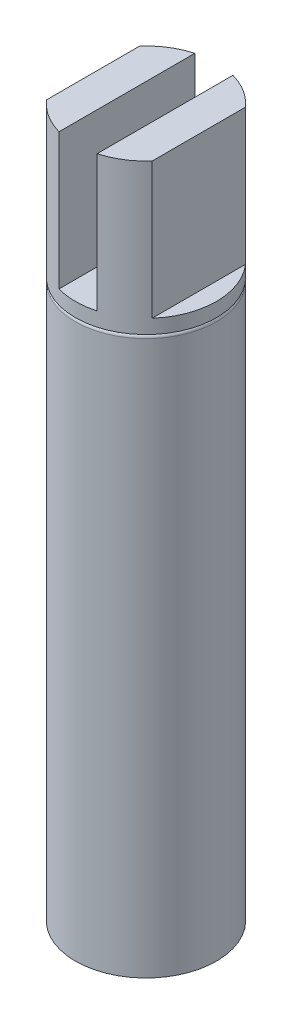
ISO-10303-21;
HEADER;
FILE_DESCRIPTION(('STEP AP214'),'2;1');
FILE_NAME('part.step','',(''),(''),'','','');
FILE_SCHEMA(('AUTOMOTIVE_DESIGN { 1 0 10303 214 1 1 1 1 }'));
ENDSEC;
DATA;
#1=APPLICATION_CONTEXT('core data for automotive mechanical design processes');
#2=APPLICATION_PROTOCOL_DEFINITION('international standard','automotive_design',2000,#1);
#3=PRODUCT_CONTEXT('',#1,'mechanical');
#4=PRODUCT('Part','Part','',(#3));
#5=PRODUCT_RELATED_PRODUCT_CATEGORY('part','',(#4));
#6=PRODUCT_DEFINITION_FORMATION('','',#4);
#7=PRODUCT_DEFINITION_CONTEXT('part definition',#1,'design');
#8=PRODUCT_DEFINITION('design','',#6,#7);
#9=PRODUCT_DEFINITION_SHAPE('','',#8);
#10=(LENGTH_UNIT() NAMED_UNIT(*) SI_UNIT(.MILLI.,.METRE.));
#11=(NAMED_UNIT(*) PLANE_ANGLE_UNIT() SI_UNIT($,.RADIAN.));
#12=(NAMED_UNIT(*) SI_UNIT($,.STERADIAN.) SOLID_ANGLE_UNIT());
#13=UNCERTAINTY_MEASURE_WITH_UNIT(LENGTH_MEASURE(1.E-05),#10,'distance_accuracy_value','');
#14=(GEOMETRIC_REPRESENTATION_CONTEXT(3) GLOBAL_UNCERTAINTY_ASSIGNED_CONTEXT((#13)) GLOBAL_UNIT_ASSIGNED_CONTEXT((#10,
#11,#12)) REPRESENTATION_CONTEXT('',''));
#15=CARTESIAN_POINT('',(0.,0.,0.));
#16=DIRECTION('',(0.,0.,1.));
#17=DIRECTION('',(1.,0.,0.));
#18=AXIS2_PLACEMENT_3D('',#15,#16,#17);
#19=CARTESIAN_POINT('',(0.,81.,0.));
#20=DIRECTION('',(0.,1.,0.));
#21=DIRECTION('',(0.,0.,1.));
#22=AXIS2_PLACEMENT_3D('',#19,#20,#21);
#23=PLANE('',#22);
#24=CARTESIAN_POINT('',(0.,81.,0.));
#25=DIRECTION('',(0.,1.,0.));
#26=DIRECTION('',(0.,0.,1.));
#27=AXIS2_PLACEMENT_3D('',#24,#25,#26);
#28=CIRCLE('',#27,10.);
#29=CARTESIAN_POINT('',(-2.7,81.,9.62860322165162));
#30=VERTEX_POINT('',#29);
#31=CARTESIAN_POINT('',(2.7,81.,9.62860322165162));
#32=VERTEX_POINT('',#31);
#33=EDGE_CURVE('E158',#30,#32,#28,.T.);
#34=ORIENTED_EDGE('',*,*,#33,.T.);
#35=DIRECTION('',(0.,0.,1.));
#36=VECTOR('',#35,1.);
#37=CARTESIAN_POINT('',(2.7,81.,0.));
#38=LINE('',#37,#36);
#39=CARTESIAN_POINT('',(2.69999999999999,81.,-9.62860322165162));
#40=VERTEX_POINT('',#39);
#41=EDGE_CURVE('E120',#40,#32,#38,.T.);
#42=ORIENTED_EDGE('',*,*,#41,.F.);
#43=CARTESIAN_POINT('',(-2.7,81.,-9.62860322165162));
#44=VERTEX_POINT('',#43);
#45=EDGE_CURVE('E161',#40,#44,#28,.T.);
#46=ORIENTED_EDGE('',*,*,#45,.T.);
#47=DIRECTION('',(0.,0.,1.));
#48=VECTOR('',#47,1.);
#49=CARTESIAN_POINT('',(-2.7,81.,0.));
#50=LINE('',#49,#48);
#51=EDGE_CURVE('E103',#44,#30,#50,.T.);
#52=ORIENTED_EDGE('',*,*,#51,.T.);
#53=EDGE_LOOP('',(#34,#42,#46,#52));
#54=FACE_BOUND('',#53,.T.);
#55=ADVANCED_FACE('F34',(#54),#23,.T.);
#56=DIRECTION('',(0.,0.,1.));
#57=VECTOR('',#56,1.);
#58=CARTESIAN_POINT('',(7.5,81.,0.));
#59=LINE('',#58,#57);
#60=CARTESIAN_POINT('',(7.5,81.,-6.61437827766147));
#61=VERTEX_POINT('',#60);
#62=CARTESIAN_POINT('',(7.5,81.,6.61437827766147));
#63=VERTEX_POINT('',#62);
#64=EDGE_CURVE('E52',#61,#63,#59,.T.);
#65=ORIENTED_EDGE('',*,*,#64,.T.);
#66=EDGE_CURVE('E48',#63,#61,#28,.T.);
#67=ORIENTED_EDGE('',*,*,#66,.T.);
#68=EDGE_LOOP('',(#65,#67));
#69=FACE_BOUND('',#68,.T.);
#70=ADVANCED_FACE('F186',(#69),#23,.T.);
#71=CARTESIAN_POINT('',(0.,79.,0.));
#72=DIRECTION('',(0.,-1.,0.));
#73=DIRECTION('',(0.,0.,-1.));
#74=AXIS2_PLACEMENT_3D('',#71,#72,#73);
#75=CYLINDRICAL_SURFACE('',#74,10.);
#76=CARTESIAN_POINT('',(0.,78.5,0.));
#77=DIRECTION('',(0.,1.,0.));
#78=DIRECTION('',(0.,0.,1.));
#79=AXIS2_PLACEMENT_3D('',#76,#77,#78);
#80=CIRCLE('',#79,10.);
#81=CARTESIAN_POINT('',(0.,78.5,10.));
#82=VERTEX_POINT('',#81);
#83=EDGE_CURVE('E11',#82,#82,#80,.F.);
#84=ORIENTED_EDGE('',*,*,#83,.T.);
#85=EDGE_LOOP('',(#84));
#86=FACE_BOUND('',#85,.T.);
#87=CARTESIAN_POINT('',(0.,0.,0.));
#88=DIRECTION('',(0.,1.,0.));
#89=DIRECTION('',(0.,0.,1.));
#90=AXIS2_PLACEMENT_3D('',#87,#88,#89);
#91=CIRCLE('',#90,10.);
#92=CARTESIAN_POINT('',(0.,0.,10.));
#93=VERTEX_POINT('',#92);
#94=EDGE_CURVE('E164',#93,#93,#91,.T.);
#95=ORIENTED_EDGE('',*,*,#94,.T.);
#96=EDGE_LOOP('',(#95));
#97=FACE_BOUND('',#96,.T.);
#98=ADVANCED_FACE('F181',(#86,#97),#75,.T.);
#99=CARTESIAN_POINT('',(0.,0.,0.));
#100=DIRECTION('',(0.,1.,0.));
#101=DIRECTION('',(0.,0.,1.));
#102=AXIS2_PLACEMENT_3D('',#99,#100,#101);
#103=PLANE('',#102);
#104=ORIENTED_EDGE('',*,*,#94,.F.);
#105=EDGE_LOOP('',(#104));
#106=FACE_BOUND('',#105,.T.);
#107=ADVANCED_FACE('F173',(#106),#103,.F.);
#108=CARTESIAN_POINT('',(0.,78.5,0.));
#109=DIRECTION('',(0.,1.,0.));
#110=DIRECTION('',(0.,0.,1.));
#111=AXIS2_PLACEMENT_3D('',#108,#109,#110);
#112=TOROIDAL_SURFACE('',#111,9.5,0.5);
#113=ORIENTED_EDGE('',*,*,#83,.F.);
#114=EDGE_LOOP('',(#113));
#115=FACE_BOUND('',#114,.T.);
#116=CARTESIAN_POINT('',(0.,79.,0.));
#117=DIRECTION('',(0.,1.,0.));
#118=DIRECTION('',(0.,0.,1.));
#119=AXIS2_PLACEMENT_3D('',#116,#117,#118);
#120=CIRCLE('',#119,9.5);
#121=CARTESIAN_POINT('',(0.,79.,9.5));
#122=VERTEX_POINT('',#121);
#123=EDGE_CURVE('E42',#122,#122,#120,.T.);
#124=ORIENTED_EDGE('',*,*,#123,.F.);
#125=EDGE_LOOP('',(#124));
#126=FACE_BOUND('',#125,.T.);
#127=ADVANCED_FACE('F36',(#115,#126),#112,.T.);
#128=CARTESIAN_POINT('',(0.,81.,0.));
#129=DIRECTION('',(0.,-1.,0.));
#130=DIRECTION('',(0.,0.,-1.));
#131=AXIS2_PLACEMENT_3D('',#128,#129,#130);
#132=CYLINDRICAL_SURFACE('',#131,10.);
#133=CARTESIAN_POINT('',(-7.5,81.,-6.61437827766148));
#134=VERTEX_POINT('',#133);
#135=CARTESIAN_POINT('',(-7.5,81.,6.61437827766148));
#136=VERTEX_POINT('',#135);
#137=EDGE_CURVE('E160',#134,#136,#28,.T.);
#138=ORIENTED_EDGE('',*,*,#137,.F.);
#139=DIRECTION('',(0.,-1.,0.));
#140=VECTOR('',#139,1.);
#141=CARTESIAN_POINT('',(-7.5,100.3,-6.61437827766148));
#142=LINE('',#141,#140);
#143=CARTESIAN_POINT('',(-7.5,100.3,-6.61437827766148));
#144=VERTEX_POINT('',#143);
#145=EDGE_CURVE('E151',#144,#134,#142,.T.);
#146=ORIENTED_EDGE('',*,*,#145,.F.);
#147=CARTESIAN_POINT('',(0.,100.3,0.));
#148=DIRECTION('',(0.,1.,0.));
#149=DIRECTION('',(0.,0.,1.));
#150=AXIS2_PLACEMENT_3D('',#147,#148,#149);
#151=CIRCLE('',#150,10.);
#152=CARTESIAN_POINT('',(-2.7,100.3,-9.62860322165162));
#153=VERTEX_POINT('',#152);
#154=EDGE_CURVE('E136',#153,#144,#151,.T.);
#155=ORIENTED_EDGE('',*,*,#154,.F.);
#156=DIRECTION('',(0.,-1.,0.));
#157=VECTOR('',#156,1.);
#158=CARTESIAN_POINT('',(-2.7,100.3,-9.62860322165162));
#159=LINE('',#158,#157);
#160=EDGE_CURVE('E154',#153,#44,#159,.T.);
#161=ORIENTED_EDGE('',*,*,#160,.T.);
#162=ORIENTED_EDGE('',*,*,#45,.F.);
#163=DIRECTION('',(0.,-1.,0.));
#164=VECTOR('',#163,1.);
#165=CARTESIAN_POINT('',(2.69999999999999,100.3,-9.62860322165162));
#166=LINE('',#165,#164);
#167=CARTESIAN_POINT('',(2.69999999999999,100.3,-9.62860322165162));
#168=VERTEX_POINT('',#167);
#169=EDGE_CURVE('E104',#168,#40,#166,.T.);
#170=ORIENTED_EDGE('',*,*,#169,.F.);
#171=CARTESIAN_POINT('',(0.,100.3,0.));
#172=DIRECTION('',(0.,1.,0.));
#173=DIRECTION('',(0.,0.,1.));
#174=AXIS2_PLACEMENT_3D('',#171,#172,#173);
#175=CIRCLE('',#174,10.);
#176=CARTESIAN_POINT('',(7.5,100.3,-6.61437827766147));
#177=VERTEX_POINT('',#176);
#178=EDGE_CURVE('E107',#177,#168,#175,.T.);
#179=ORIENTED_EDGE('',*,*,#178,.F.);
#180=DIRECTION('',(0.,-1.,0.));
#181=VECTOR('',#180,1.);
#182=CARTESIAN_POINT('',(7.5,100.3,-6.61437827766147));
#183=LINE('',#182,#181);
#184=EDGE_CURVE('E96',#177,#61,#183,.T.);
#185=ORIENTED_EDGE('',*,*,#184,.T.);
#186=ORIENTED_EDGE('',*,*,#66,.F.);
#187=DIRECTION('',(0.,-1.,0.));
#188=VECTOR('',#187,1.);
#189=CARTESIAN_POINT('',(7.5,100.3,6.61437827766147));
#190=LINE('',#189,#188);
#191=CARTESIAN_POINT('',(7.5,100.3,6.61437827766147));
#192=VERTEX_POINT('',#191);
#193=EDGE_CURVE('E127',#192,#63,#190,.T.);
#194=ORIENTED_EDGE('',*,*,#193,.F.);
#195=CARTESIAN_POINT('',(2.7,100.3,9.62860322165162));
#196=VERTEX_POINT('',#195);
#197=EDGE_CURVE('E116',#196,#192,#175,.T.);
#198=ORIENTED_EDGE('',*,*,#197,.F.);
#199=DIRECTION('',(0.,-1.,0.));
#200=VECTOR('',#199,1.);
#201=CARTESIAN_POINT('',(2.7,100.3,9.62860322165162));
#202=LINE('',#201,#200);
#203=EDGE_CURVE('E129',#196,#32,#202,.T.);
#204=ORIENTED_EDGE('',*,*,#203,.T.);
#205=ORIENTED_EDGE('',*,*,#33,.F.);
#206=DIRECTION('',(0.,-1.,0.));
#207=VECTOR('',#206,1.);
#208=CARTESIAN_POINT('',(-2.7,100.3,9.62860322165162));
#209=LINE('',#208,#207);
#210=CARTESIAN_POINT('',(-2.7,100.3,9.62860322165162));
#211=VERTEX_POINT('',#210);
#212=EDGE_CURVE('E145',#211,#30,#209,.T.);
#213=ORIENTED_EDGE('',*,*,#212,.F.);
#214=CARTESIAN_POINT('',(-7.5,100.3,6.61437827766148));
#215=VERTEX_POINT('',#214);
#216=EDGE_CURVE('E140',#215,#211,#151,.T.);
#217=ORIENTED_EDGE('',*,*,#216,.F.);
#218=DIRECTION('',(0.,-1.,0.));
#219=VECTOR('',#218,1.);
#220=CARTESIAN_POINT('',(-7.5,100.3,6.61437827766148));
#221=LINE('',#220,#219);
#222=EDGE_CURVE('E148',#215,#136,#221,.T.);
#223=ORIENTED_EDGE('',*,*,#222,.T.);
#224=EDGE_LOOP('',(#138,#146,#155,#161,#162,#170,#179,#185,#186,#194,#198,#204,#205,#213,#217,#223));
#225=FACE_BOUND('',#224,.T.);
#226=CARTESIAN_POINT('',(0.,79.,0.));
#227=DIRECTION('',(0.,1.,0.));
#228=DIRECTION('',(0.,0.,1.));
#229=AXIS2_PLACEMENT_3D('',#226,#227,#228);
#230=CIRCLE('',#229,10.);
#231=CARTESIAN_POINT('',(0.,79.,10.));
#232=VERTEX_POINT('',#231);
#233=EDGE_CURVE('E157',#232,#232,#230,.T.);
#234=ORIENTED_EDGE('',*,*,#233,.T.);
#235=EDGE_LOOP('',(#234));
#236=FACE_BOUND('',#235,.T.);
#237=ADVANCED_FACE('F109',(#225,#236),#132,.T.);
#238=DIRECTION('',(0.,0.,1.));
#239=VECTOR('',#238,1.);
#240=CARTESIAN_POINT('',(-7.5,81.,0.));
#241=LINE('',#240,#239);
#242=EDGE_CURVE('E137',#134,#136,#241,.T.);
#243=ORIENTED_EDGE('',*,*,#242,.F.);
#244=ORIENTED_EDGE('',*,*,#137,.T.);
#245=EDGE_LOOP('',(#243,#244));
#246=FACE_BOUND('',#245,.T.);
#247=ADVANCED_FACE('F179',(#246),#23,.T.);
#248=CARTESIAN_POINT('',(0.,79.,0.));
#249=DIRECTION('',(0.,1.,0.));
#250=DIRECTION('',(0.,0.,1.));
#251=AXIS2_PLACEMENT_3D('',#248,#249,#250);
#252=PLANE('',#251);
#253=ORIENTED_EDGE('',*,*,#123,.T.);
#254=EDGE_LOOP('',(#253));
#255=FACE_BOUND('',#254,.T.);
#256=ORIENTED_EDGE('',*,*,#233,.F.);
#257=EDGE_LOOP('',(#256));
#258=FACE_BOUND('',#257,.T.);
#259=ADVANCED_FACE('F169',(#255,#258),#252,.F.);
#260=CARTESIAN_POINT('',(-2.7,100.3,0.));
#261=DIRECTION('',(1.,0.,0.));
#262=DIRECTION('',(0.,0.,-1.));
#263=AXIS2_PLACEMENT_3D('',#260,#261,#262);
#264=PLANE('',#263);
#265=ORIENTED_EDGE('',*,*,#51,.F.);
#266=ORIENTED_EDGE('',*,*,#160,.F.);
#267=DIRECTION('',(0.,0.,1.));
#268=VECTOR('',#267,1.);
#269=CARTESIAN_POINT('',(-2.7,100.3,0.));
#270=LINE('',#269,#268);
#271=EDGE_CURVE('E133',#153,#211,#270,.T.);
#272=ORIENTED_EDGE('',*,*,#271,.T.);
#273=ORIENTED_EDGE('',*,*,#212,.T.);
#274=EDGE_LOOP('',(#265,#266,#272,#273));
#275=FACE_BOUND('',#274,.T.);
#276=ADVANCED_FACE('F199',(#275),#264,.T.);
#277=CARTESIAN_POINT('',(-7.5,100.3,0.));
#278=DIRECTION('',(1.,0.,0.));
#279=DIRECTION('',(0.,0.,-1.));
#280=AXIS2_PLACEMENT_3D('',#277,#278,#279);
#281=PLANE('',#280);
#282=ORIENTED_EDGE('',*,*,#242,.T.);
#283=ORIENTED_EDGE('',*,*,#222,.F.);
#284=DIRECTION('',(0.,0.,1.));
#285=VECTOR('',#284,1.);
#286=CARTESIAN_POINT('',(-7.5,100.3,0.));
#287=LINE('',#286,#285);
#288=EDGE_CURVE('E139',#144,#215,#287,.T.);
#289=ORIENTED_EDGE('',*,*,#288,.F.);
#290=ORIENTED_EDGE('',*,*,#145,.T.);
#291=EDGE_LOOP('',(#282,#283,#289,#290));
#292=FACE_BOUND('',#291,.T.);
#293=ADVANCED_FACE('F206',(#292),#281,.F.);
#294=CARTESIAN_POINT('',(0.,100.3,0.));
#295=DIRECTION('',(0.,1.,0.));
#296=DIRECTION('',(0.,0.,1.));
#297=AXIS2_PLACEMENT_3D('',#294,#295,#296);
#298=PLANE('',#297);
#299=ORIENTED_EDGE('',*,*,#271,.F.);
#300=ORIENTED_EDGE('',*,*,#154,.T.);
#301=ORIENTED_EDGE('',*,*,#288,.T.);
#302=ORIENTED_EDGE('',*,*,#216,.T.);
#303=EDGE_LOOP('',(#299,#300,#301,#302));
#304=FACE_BOUND('',#303,.T.);
#305=ADVANCED_FACE('F209',(#304),#298,.T.);
#306=CARTESIAN_POINT('',(7.5,100.3,0.));
#307=DIRECTION('',(1.,0.,0.));
#308=DIRECTION('',(0.,0.,-1.));
#309=AXIS2_PLACEMENT_3D('',#306,#307,#308);
#310=PLANE('',#309);
#311=ORIENTED_EDGE('',*,*,#64,.F.);
#312=ORIENTED_EDGE('',*,*,#184,.F.);
#313=DIRECTION('',(0.,0.,1.));
#314=VECTOR('',#313,1.);
#315=CARTESIAN_POINT('',(7.5,100.3,0.));
#316=LINE('',#315,#314);
#317=EDGE_CURVE('E101',#177,#192,#316,.T.);
#318=ORIENTED_EDGE('',*,*,#317,.T.);
#319=ORIENTED_EDGE('',*,*,#193,.T.);
#320=EDGE_LOOP('',(#311,#312,#318,#319));
#321=FACE_BOUND('',#320,.T.);
#322=ADVANCED_FACE('F98',(#321),#310,.T.);
#323=CARTESIAN_POINT('',(2.7,100.3,0.));
#324=DIRECTION('',(1.,0.,0.));
#325=DIRECTION('',(0.,0.,-1.));
#326=AXIS2_PLACEMENT_3D('',#323,#324,#325);
#327=PLANE('',#326);
#328=ORIENTED_EDGE('',*,*,#41,.T.);
#329=ORIENTED_EDGE('',*,*,#203,.F.);
#330=DIRECTION('',(0.,0.,1.));
#331=VECTOR('',#330,1.);
#332=CARTESIAN_POINT('',(2.7,100.3,0.));
#333=LINE('',#332,#331);
#334=EDGE_CURVE('E114',#168,#196,#333,.T.);
#335=ORIENTED_EDGE('',*,*,#334,.F.);
#336=ORIENTED_EDGE('',*,*,#169,.T.);
#337=EDGE_LOOP('',(#328,#329,#335,#336));
#338=FACE_BOUND('',#337,.T.);
#339=ADVANCED_FACE('F217',(#338),#327,.F.);
#340=CARTESIAN_POINT('',(0.,100.3,0.));
#341=DIRECTION('',(0.,1.,0.));
#342=DIRECTION('',(0.,0.,1.));
#343=AXIS2_PLACEMENT_3D('',#340,#341,#342);
#344=PLANE('',#343);
#345=ORIENTED_EDGE('',*,*,#317,.F.);
#346=ORIENTED_EDGE('',*,*,#178,.T.);
#347=ORIENTED_EDGE('',*,*,#334,.T.);
#348=ORIENTED_EDGE('',*,*,#197,.T.);
#349=EDGE_LOOP('',(#345,#346,#347,#348));
#350=FACE_BOUND('',#349,.T.);
#351=ADVANCED_FACE('F117',(#350),#344,.T.);
#352=CLOSED_SHELL('',(#55,#70,#98,#107,#127,#237,#247,#259,#276,#293,#305,#322,#339,#351));
#353=MANIFOLD_SOLID_BREP('B2',#352);
#354=ADVANCED_BREP_SHAPE_REPRESENTATION('',(#18,#353),#14);
#355=SHAPE_DEFINITION_REPRESENTATION(#9,#354);
ENDSEC;
END-ISO-10303-21;
